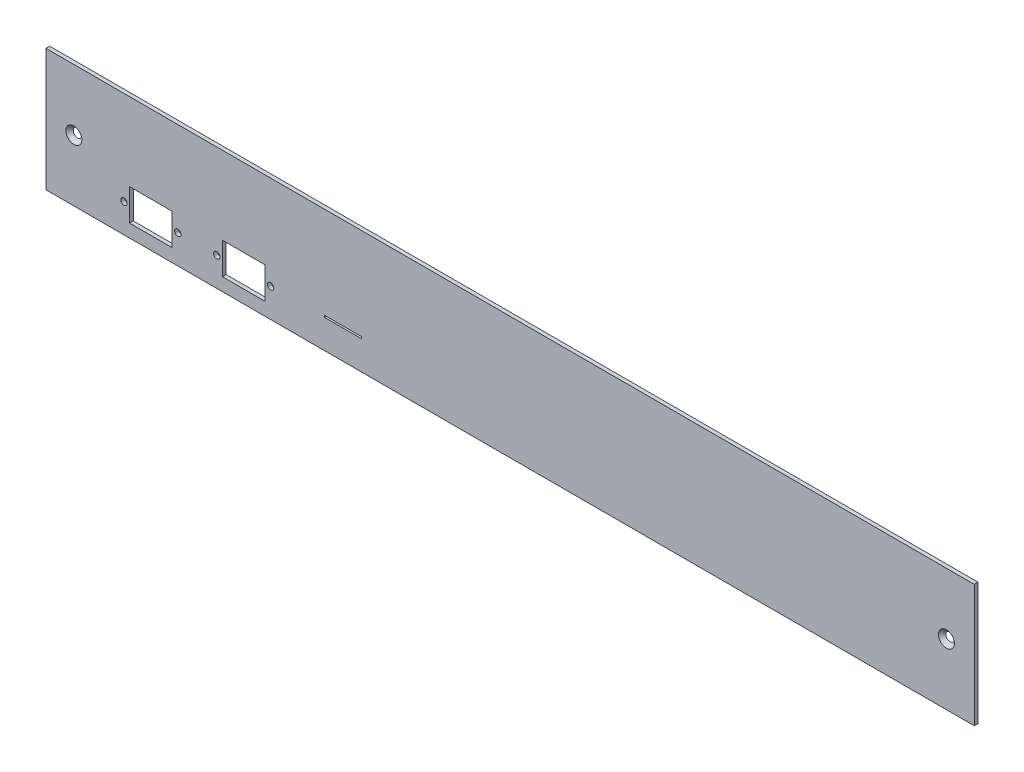
ISO-10303-21;
HEADER;
FILE_DESCRIPTION(('STEP AP214'),'2;1');
FILE_NAME('part.step','',(''),(''),'','','');
FILE_SCHEMA(('AUTOMOTIVE_DESIGN { 1 0 10303 214 1 1 1 1 }'));
ENDSEC;
DATA;
#1=APPLICATION_CONTEXT('core data for automotive mechanical design processes');
#2=APPLICATION_PROTOCOL_DEFINITION('international standard','automotive_design',2000,#1);
#3=PRODUCT_CONTEXT('',#1,'mechanical');
#4=PRODUCT('Part','Part','',(#3));
#5=PRODUCT_RELATED_PRODUCT_CATEGORY('part','',(#4));
#6=PRODUCT_DEFINITION_FORMATION('','',#4);
#7=PRODUCT_DEFINITION_CONTEXT('part definition',#1,'design');
#8=PRODUCT_DEFINITION('design','',#6,#7);
#9=PRODUCT_DEFINITION_SHAPE('','',#8);
#10=(LENGTH_UNIT() NAMED_UNIT(*) SI_UNIT(.MILLI.,.METRE.));
#11=(NAMED_UNIT(*) PLANE_ANGLE_UNIT() SI_UNIT($,.RADIAN.));
#12=(NAMED_UNIT(*) SI_UNIT($,.STERADIAN.) SOLID_ANGLE_UNIT());
#13=UNCERTAINTY_MEASURE_WITH_UNIT(LENGTH_MEASURE(1.E-05),#10,'distance_accuracy_value','');
#14=(GEOMETRIC_REPRESENTATION_CONTEXT(3) GLOBAL_UNCERTAINTY_ASSIGNED_CONTEXT((#13)) GLOBAL_UNIT_ASSIGNED_CONTEXT((#10,
#11,#12)) REPRESENTATION_CONTEXT('',''));
#15=CARTESIAN_POINT('',(0.,0.,0.));
#16=DIRECTION('',(0.,0.,1.));
#17=DIRECTION('',(1.,0.,0.));
#18=AXIS2_PLACEMENT_3D('',#15,#16,#17);
#19=CARTESIAN_POINT('',(-339.903846153846,-63.,2.));
#20=DIRECTION('',(-1.,0.,0.));
#21=DIRECTION('',(0.,-1.,0.));
#22=AXIS2_PLACEMENT_3D('',#19,#20,#21);
#23=PLANE('',#22);
#24=DIRECTION('',(0.,1.,0.));
#25=VECTOR('',#24,1.);
#26=CARTESIAN_POINT('',(-339.903846153846,-63.,0.));
#27=LINE('',#26,#25);
#28=CARTESIAN_POINT('',(-339.903846153846,-63.,0.));
#29=VERTEX_POINT('',#28);
#30=CARTESIAN_POINT('',(-339.903846153846,3.,0.));
#31=VERTEX_POINT('',#30);
#32=EDGE_CURVE('E280',#29,#31,#27,.T.);
#33=ORIENTED_EDGE('',*,*,#32,.F.);
#34=DIRECTION('',(0.,0.,-1.));
#35=VECTOR('',#34,1.);
#36=CARTESIAN_POINT('',(-339.903846153846,-63.,2.));
#37=LINE('',#36,#35);
#38=CARTESIAN_POINT('',(-339.903846153846,-63.,2.));
#39=VERTEX_POINT('',#38);
#40=EDGE_CURVE('E444',#39,#29,#37,.T.);
#41=ORIENTED_EDGE('',*,*,#40,.F.);
#42=DIRECTION('',(0.,1.,0.));
#43=VECTOR('',#42,1.);
#44=CARTESIAN_POINT('',(-339.903846153846,-63.,2.));
#45=LINE('',#44,#43);
#46=CARTESIAN_POINT('',(-339.903846153846,3.,2.));
#47=VERTEX_POINT('',#46);
#48=EDGE_CURVE('E263',#39,#47,#45,.T.);
#49=ORIENTED_EDGE('',*,*,#48,.T.);
#50=DIRECTION('',(0.,0.,-1.));
#51=VECTOR('',#50,1.);
#52=CARTESIAN_POINT('',(-339.903846153846,3.,2.));
#53=LINE('',#52,#51);
#54=EDGE_CURVE('E279',#47,#31,#53,.T.);
#55=ORIENTED_EDGE('',*,*,#54,.T.);
#56=EDGE_LOOP('',(#33,#41,#49,#55));
#57=FACE_BOUND('',#56,.T.);
#58=ADVANCED_FACE('F46',(#57),#23,.T.);
#59=CARTESIAN_POINT('',(-316.903846153846,-63.,2.));
#60=DIRECTION('',(0.,-1.,0.));
#61=DIRECTION('',(1.,0.,0.));
#62=AXIS2_PLACEMENT_3D('',#59,#60,#61);
#63=PLANE('',#62);
#64=DIRECTION('',(-1.,0.,0.));
#65=VECTOR('',#64,1.);
#66=CARTESIAN_POINT('',(-316.903846153846,-63.,0.));
#67=LINE('',#66,#65);
#68=CARTESIAN_POINT('',(160.096153846153,-62.9999999999999,0.));
#69=VERTEX_POINT('',#68);
#70=EDGE_CURVE('E268',#69,#29,#67,.T.);
#71=ORIENTED_EDGE('',*,*,#70,.F.);
#72=DIRECTION('',(0.,0.,-1.));
#73=VECTOR('',#72,1.);
#74=CARTESIAN_POINT('',(160.096153846153,-62.9999999999999,2.));
#75=LINE('',#74,#73);
#76=CARTESIAN_POINT('',(160.096153846153,-62.9999999999999,2.));
#77=VERTEX_POINT('',#76);
#78=EDGE_CURVE('E448',#77,#69,#75,.T.);
#79=ORIENTED_EDGE('',*,*,#78,.F.);
#80=DIRECTION('',(-1.,0.,0.));
#81=VECTOR('',#80,1.);
#82=CARTESIAN_POINT('',(160.096153846153,-62.9999999999999,2.));
#83=LINE('',#82,#81);
#84=EDGE_CURVE('E276',#77,#39,#83,.T.);
#85=ORIENTED_EDGE('',*,*,#84,.T.);
#86=ORIENTED_EDGE('',*,*,#40,.T.);
#87=EDGE_LOOP('',(#71,#79,#85,#86));
#88=FACE_BOUND('',#87,.T.);
#89=ADVANCED_FACE('F472',(#88),#63,.T.);
#90=CARTESIAN_POINT('',(160.096153846154,3.,2.));
#91=DIRECTION('',(1.,0.,0.));
#92=DIRECTION('',(0.,1.,0.));
#93=AXIS2_PLACEMENT_3D('',#90,#91,#92);
#94=PLANE('',#93);
#95=DIRECTION('',(0.,-1.,0.));
#96=VECTOR('',#95,1.);
#97=CARTESIAN_POINT('',(160.096153846154,3.,0.));
#98=LINE('',#97,#96);
#99=CARTESIAN_POINT('',(160.096153846154,3.,0.));
#100=VERTEX_POINT('',#99);
#101=EDGE_CURVE('E462',#100,#69,#98,.T.);
#102=ORIENTED_EDGE('',*,*,#101,.F.);
#103=DIRECTION('',(0.,0.,-1.));
#104=VECTOR('',#103,1.);
#105=CARTESIAN_POINT('',(160.096153846154,3.,2.));
#106=LINE('',#105,#104);
#107=CARTESIAN_POINT('',(160.096153846154,3.,2.));
#108=VERTEX_POINT('',#107);
#109=EDGE_CURVE('E453',#108,#100,#106,.T.);
#110=ORIENTED_EDGE('',*,*,#109,.F.);
#111=DIRECTION('',(0.,-1.,0.));
#112=VECTOR('',#111,1.);
#113=CARTESIAN_POINT('',(160.096153846154,3.,2.));
#114=LINE('',#113,#112);
#115=EDGE_CURVE('E272',#108,#77,#114,.T.);
#116=ORIENTED_EDGE('',*,*,#115,.T.);
#117=ORIENTED_EDGE('',*,*,#78,.T.);
#118=EDGE_LOOP('',(#102,#110,#116,#117));
#119=FACE_BOUND('',#118,.T.);
#120=ADVANCED_FACE('F468',(#119),#94,.T.);
#121=CARTESIAN_POINT('',(-339.903846153846,3.,2.));
#122=DIRECTION('',(0.,1.,0.));
#123=DIRECTION('',(0.,0.,1.));
#124=AXIS2_PLACEMENT_3D('',#121,#122,#123);
#125=PLANE('',#124);
#126=DIRECTION('',(1.,0.,0.));
#127=VECTOR('',#126,1.);
#128=CARTESIAN_POINT('',(-339.903846153846,3.,0.));
#129=LINE('',#128,#127);
#130=EDGE_CURVE('E285',#31,#100,#129,.T.);
#131=ORIENTED_EDGE('',*,*,#130,.F.);
#132=ORIENTED_EDGE('',*,*,#54,.F.);
#133=DIRECTION('',(1.,0.,0.));
#134=VECTOR('',#133,1.);
#135=CARTESIAN_POINT('',(-339.903846153846,3.,2.));
#136=LINE('',#135,#134);
#137=EDGE_CURVE('E267',#47,#108,#136,.T.);
#138=ORIENTED_EDGE('',*,*,#137,.T.);
#139=ORIENTED_EDGE('',*,*,#109,.T.);
#140=EDGE_LOOP('',(#131,#132,#138,#139));
#141=FACE_BOUND('',#140,.T.);
#142=ADVANCED_FACE('F418',(#141),#125,.T.);
#143=CARTESIAN_POINT('',(0.,0.,2.));
#144=DIRECTION('',(0.,0.,-1.));
#145=DIRECTION('',(-1.,0.,0.));
#146=AXIS2_PLACEMENT_3D('',#143,#144,#145);
#147=PLANE('',#146);
#148=CARTESIAN_POINT('',(-297.903846153846,-47.5,2.));
#149=DIRECTION('',(0.,0.,1.));
#150=DIRECTION('',(1.,0.,0.));
#151=AXIS2_PLACEMENT_3D('',#148,#149,#150);
#152=CIRCLE('',#151,1.69999999999996);
#153=CARTESIAN_POINT('',(-296.203846153846,-47.5,2.));
#154=VERTEX_POINT('',#153);
#155=EDGE_CURVE('E192',#154,#154,#152,.T.);
#156=ORIENTED_EDGE('',*,*,#155,.F.);
#157=EDGE_LOOP('',(#156));
#158=FACE_BOUND('',#157,.T.);
#159=CARTESIAN_POINT('',(-268.903846153846,-47.5,2.));
#160=DIRECTION('',(0.,0.,1.));
#161=DIRECTION('',(1.,0.,0.));
#162=AXIS2_PLACEMENT_3D('',#159,#160,#161);
#163=CIRCLE('',#162,1.6999999999999);
#164=CARTESIAN_POINT('',(-267.203846153846,-47.5,2.));
#165=VERTEX_POINT('',#164);
#166=EDGE_CURVE('E187',#165,#165,#163,.T.);
#167=ORIENTED_EDGE('',*,*,#166,.F.);
#168=EDGE_LOOP('',(#167));
#169=FACE_BOUND('',#168,.T.);
#170=DIRECTION('',(1.,0.,0.));
#171=VECTOR('',#170,1.);
#172=CARTESIAN_POINT('',(-189.903846153846,-47.5,2.));
#173=LINE('',#172,#171);
#174=CARTESIAN_POINT('',(-189.903846153846,-47.5,2.));
#175=VERTEX_POINT('',#174);
#176=CARTESIAN_POINT('',(-169.903846153846,-47.5,2.));
#177=VERTEX_POINT('',#176);
#178=EDGE_CURVE('E185',#175,#177,#173,.T.);
#179=ORIENTED_EDGE('',*,*,#178,.F.);
#180=DIRECTION('',(0.,-1.,0.));
#181=VECTOR('',#180,1.);
#182=CARTESIAN_POINT('',(-189.903846153846,-46.5,2.));
#183=LINE('',#182,#181);
#184=CARTESIAN_POINT('',(-189.903846153846,-46.5,2.));
#185=VERTEX_POINT('',#184);
#186=EDGE_CURVE('E64',#185,#175,#183,.T.);
#187=ORIENTED_EDGE('',*,*,#186,.F.);
#188=DIRECTION('',(-1.,0.,0.));
#189=VECTOR('',#188,1.);
#190=CARTESIAN_POINT('',(-189.903846153846,-46.5,2.));
#191=LINE('',#190,#189);
#192=CARTESIAN_POINT('',(-169.903846153846,-46.5,2.));
#193=VERTEX_POINT('',#192);
#194=EDGE_CURVE('E171',#193,#185,#191,.T.);
#195=ORIENTED_EDGE('',*,*,#194,.F.);
#196=DIRECTION('',(0.,1.,0.));
#197=VECTOR('',#196,1.);
#198=CARTESIAN_POINT('',(-169.903846153846,-46.5,2.));
#199=LINE('',#198,#197);
#200=EDGE_CURVE('E178',#177,#193,#199,.T.);
#201=ORIENTED_EDGE('',*,*,#200,.F.);
#202=EDGE_LOOP('',(#179,#187,#195,#201));
#203=FACE_BOUND('',#202,.T.);
#204=DIRECTION('',(1.,0.,0.));
#205=VECTOR('',#204,1.);
#206=CARTESIAN_POINT('',(-244.903846153846,-56.,2.));
#207=LINE('',#206,#205);
#208=CARTESIAN_POINT('',(-244.903846153846,-56.,2.));
#209=VERTEX_POINT('',#208);
#210=CARTESIAN_POINT('',(-221.903846153846,-56.,2.));
#211=VERTEX_POINT('',#210);
#212=EDGE_CURVE('E218',#209,#211,#207,.T.);
#213=ORIENTED_EDGE('',*,*,#212,.F.);
#214=DIRECTION('',(0.,-1.,0.));
#215=VECTOR('',#214,1.);
#216=CARTESIAN_POINT('',(-244.903846153846,-39.,2.));
#217=LINE('',#216,#215);
#218=CARTESIAN_POINT('',(-244.903846153846,-39.,2.));
#219=VERTEX_POINT('',#218);
#220=EDGE_CURVE('E72',#219,#209,#217,.T.);
#221=ORIENTED_EDGE('',*,*,#220,.F.);
#222=DIRECTION('',(-1.,0.,0.));
#223=VECTOR('',#222,1.);
#224=CARTESIAN_POINT('',(-244.903846153846,-39.,2.));
#225=LINE('',#224,#223);
#226=CARTESIAN_POINT('',(-221.903846153846,-39.,2.));
#227=VERTEX_POINT('',#226);
#228=EDGE_CURVE('E200',#227,#219,#225,.T.);
#229=ORIENTED_EDGE('',*,*,#228,.F.);
#230=DIRECTION('',(0.,1.,0.));
#231=VECTOR('',#230,1.);
#232=CARTESIAN_POINT('',(-221.903846153846,-39.,2.));
#233=LINE('',#232,#231);
#234=EDGE_CURVE('E214',#211,#227,#233,.T.);
#235=ORIENTED_EDGE('',*,*,#234,.F.);
#236=EDGE_LOOP('',(#213,#221,#229,#235));
#237=FACE_BOUND('',#236,.T.);
#238=CARTESIAN_POINT('',(-247.903846153846,-47.5,2.));
#239=DIRECTION('',(0.,0.,1.));
#240=DIRECTION('',(1.,0.,0.));
#241=AXIS2_PLACEMENT_3D('',#238,#239,#240);
#242=CIRCLE('',#241,1.69999999999996);
#243=CARTESIAN_POINT('',(-246.203846153846,-47.5,2.));
#244=VERTEX_POINT('',#243);
#245=EDGE_CURVE('E210',#244,#244,#242,.T.);
#246=ORIENTED_EDGE('',*,*,#245,.F.);
#247=EDGE_LOOP('',(#246));
#248=FACE_BOUND('',#247,.T.);
#249=CARTESIAN_POINT('',(-218.903846153846,-47.5,2.));
#250=DIRECTION('',(0.,0.,1.));
#251=DIRECTION('',(1.,0.,0.));
#252=AXIS2_PLACEMENT_3D('',#249,#250,#251);
#253=CIRCLE('',#252,1.6999999999999);
#254=CARTESIAN_POINT('',(-217.203846153846,-47.5,2.));
#255=VERTEX_POINT('',#254);
#256=EDGE_CURVE('E427',#255,#255,#253,.T.);
#257=ORIENTED_EDGE('',*,*,#256,.F.);
#258=EDGE_LOOP('',(#257));
#259=FACE_BOUND('',#258,.T.);
#260=DIRECTION('',(1.,0.,0.));
#261=VECTOR('',#260,1.);
#262=CARTESIAN_POINT('',(-294.903846153846,-56.,2.));
#263=LINE('',#262,#261);
#264=CARTESIAN_POINT('',(-294.903846153846,-56.,2.));
#265=VERTEX_POINT('',#264);
#266=CARTESIAN_POINT('',(-271.903846153846,-56.,2.));
#267=VERTEX_POINT('',#266);
#268=EDGE_CURVE('E227',#265,#267,#263,.T.);
#269=ORIENTED_EDGE('',*,*,#268,.F.);
#270=DIRECTION('',(0.,-1.,0.));
#271=VECTOR('',#270,1.);
#272=CARTESIAN_POINT('',(-294.903846153846,-39.,2.));
#273=LINE('',#272,#271);
#274=CARTESIAN_POINT('',(-294.903846153846,-39.,2.));
#275=VERTEX_POINT('',#274);
#276=EDGE_CURVE('E224',#275,#265,#273,.T.);
#277=ORIENTED_EDGE('',*,*,#276,.F.);
#278=DIRECTION('',(-1.,0.,0.));
#279=VECTOR('',#278,1.);
#280=CARTESIAN_POINT('',(-294.903846153846,-39.,2.));
#281=LINE('',#280,#279);
#282=CARTESIAN_POINT('',(-271.903846153846,-39.,2.));
#283=VERTEX_POINT('',#282);
#284=EDGE_CURVE('E235',#283,#275,#281,.T.);
#285=ORIENTED_EDGE('',*,*,#284,.F.);
#286=DIRECTION('',(0.,1.,0.));
#287=VECTOR('',#286,1.);
#288=CARTESIAN_POINT('',(-271.903846153846,-39.,2.));
#289=LINE('',#288,#287);
#290=EDGE_CURVE('E231',#267,#283,#289,.T.);
#291=ORIENTED_EDGE('',*,*,#290,.F.);
#292=EDGE_LOOP('',(#269,#277,#285,#291));
#293=FACE_BOUND('',#292,.T.);
#294=CARTESIAN_POINT('',(-324.903846153846,-30.,2.));
#295=DIRECTION('',(0.,0.,1.));
#296=DIRECTION('',(1.,0.,0.));
#297=AXIS2_PLACEMENT_3D('',#294,#295,#296);
#298=CIRCLE('',#297,4.30000000000003);
#299=CARTESIAN_POINT('',(-320.603846153846,-30.,2.));
#300=VERTEX_POINT('',#299);
#301=EDGE_CURVE('E253',#300,#300,#298,.T.);
#302=ORIENTED_EDGE('',*,*,#301,.F.);
#303=EDGE_LOOP('',(#302));
#304=FACE_BOUND('',#303,.T.);
#305=CARTESIAN_POINT('',(145.096153846153,-30.,2.));
#306=DIRECTION('',(0.,0.,1.));
#307=DIRECTION('',(1.,0.,0.));
#308=AXIS2_PLACEMENT_3D('',#305,#306,#307);
#309=CIRCLE('',#308,4.3);
#310=CARTESIAN_POINT('',(149.396153846153,-30.,2.));
#311=VERTEX_POINT('',#310);
#312=EDGE_CURVE('E258',#311,#311,#309,.T.);
#313=ORIENTED_EDGE('',*,*,#312,.F.);
#314=EDGE_LOOP('',(#313));
#315=FACE_BOUND('',#314,.T.);
#316=ORIENTED_EDGE('',*,*,#48,.F.);
#317=ORIENTED_EDGE('',*,*,#84,.F.);
#318=ORIENTED_EDGE('',*,*,#115,.F.);
#319=ORIENTED_EDGE('',*,*,#137,.F.);
#320=EDGE_LOOP('',(#316,#317,#318,#319));
#321=FACE_BOUND('',#320,.T.);
#322=ADVANCED_FACE('F182',(#158,#169,#203,#237,#248,#259,#293,#304,#315,#321),#147,.F.);
#323=CARTESIAN_POINT('',(0.,0.,0.));
#324=DIRECTION('',(0.,0.,-1.));
#325=DIRECTION('',(-1.,0.,0.));
#326=AXIS2_PLACEMENT_3D('',#323,#324,#325);
#327=PLANE('',#326);
#328=ORIENTED_EDGE('',*,*,#101,.T.);
#329=ORIENTED_EDGE('',*,*,#70,.T.);
#330=ORIENTED_EDGE('',*,*,#32,.T.);
#331=ORIENTED_EDGE('',*,*,#130,.T.);
#332=EDGE_LOOP('',(#328,#329,#330,#331));
#333=FACE_BOUND('',#332,.T.);
#334=CARTESIAN_POINT('',(-297.903846153846,-47.5,0.));
#335=DIRECTION('',(0.,0.,-1.));
#336=DIRECTION('',(-1.,0.,0.));
#337=AXIS2_PLACEMENT_3D('',#334,#335,#336);
#338=CIRCLE('',#337,1.69999999999996);
#339=CARTESIAN_POINT('',(-299.603846153846,-47.5,0.));
#340=VERTEX_POINT('',#339);
#341=EDGE_CURVE('E49',#340,#340,#338,.T.);
#342=ORIENTED_EDGE('',*,*,#341,.F.);
#343=EDGE_LOOP('',(#342));
#344=FACE_BOUND('',#343,.T.);
#345=CARTESIAN_POINT('',(-268.903846153846,-47.5,0.));
#346=DIRECTION('',(0.,0.,-1.));
#347=DIRECTION('',(-1.,0.,0.));
#348=AXIS2_PLACEMENT_3D('',#345,#346,#347);
#349=CIRCLE('',#348,1.6999999999999);
#350=CARTESIAN_POINT('',(-270.603846153846,-47.5,0.));
#351=VERTEX_POINT('',#350);
#352=EDGE_CURVE('E297',#351,#351,#349,.T.);
#353=ORIENTED_EDGE('',*,*,#352,.F.);
#354=EDGE_LOOP('',(#353));
#355=FACE_BOUND('',#354,.T.);
#356=DIRECTION('',(0.,1.,0.));
#357=VECTOR('',#356,1.);
#358=CARTESIAN_POINT('',(-189.903846153846,0.,0.));
#359=LINE('',#358,#357);
#360=CARTESIAN_POINT('',(-189.903846153846,-47.5,0.));
#361=VERTEX_POINT('',#360);
#362=CARTESIAN_POINT('',(-189.903846153846,-46.5,0.));
#363=VERTEX_POINT('',#362);
#364=EDGE_CURVE('E12',#361,#363,#359,.T.);
#365=ORIENTED_EDGE('',*,*,#364,.F.);
#366=DIRECTION('',(-1.,0.,0.));
#367=VECTOR('',#366,1.);
#368=CARTESIAN_POINT('',(0.,-47.5,0.));
#369=LINE('',#368,#367);
#370=CARTESIAN_POINT('',(-169.903846153846,-47.5,0.));
#371=VERTEX_POINT('',#370);
#372=EDGE_CURVE('E321',#371,#361,#369,.T.);
#373=ORIENTED_EDGE('',*,*,#372,.F.);
#374=DIRECTION('',(0.,-1.,0.));
#375=VECTOR('',#374,1.);
#376=CARTESIAN_POINT('',(-169.903846153846,0.,0.));
#377=LINE('',#376,#375);
#378=CARTESIAN_POINT('',(-169.903846153846,-46.5,0.));
#379=VERTEX_POINT('',#378);
#380=EDGE_CURVE('E307',#379,#371,#377,.T.);
#381=ORIENTED_EDGE('',*,*,#380,.F.);
#382=DIRECTION('',(1.,0.,0.));
#383=VECTOR('',#382,1.);
#384=CARTESIAN_POINT('',(0.,-46.5,0.));
#385=LINE('',#384,#383);
#386=EDGE_CURVE('E56',#363,#379,#385,.T.);
#387=ORIENTED_EDGE('',*,*,#386,.F.);
#388=EDGE_LOOP('',(#365,#373,#381,#387));
#389=FACE_BOUND('',#388,.T.);
#390=DIRECTION('',(0.,1.,0.));
#391=VECTOR('',#390,1.);
#392=CARTESIAN_POINT('',(-244.903846153846,0.,0.));
#393=LINE('',#392,#391);
#394=CARTESIAN_POINT('',(-244.903846153846,-56.,0.));
#395=VERTEX_POINT('',#394);
#396=CARTESIAN_POINT('',(-244.903846153846,-39.,0.));
#397=VERTEX_POINT('',#396);
#398=EDGE_CURVE('E317',#395,#397,#393,.T.);
#399=ORIENTED_EDGE('',*,*,#398,.F.);
#400=DIRECTION('',(-1.,0.,0.));
#401=VECTOR('',#400,1.);
#402=CARTESIAN_POINT('',(0.,-56.,0.));
#403=LINE('',#402,#401);
#404=CARTESIAN_POINT('',(-221.903846153846,-56.,0.));
#405=VERTEX_POINT('',#404);
#406=EDGE_CURVE('E387',#405,#395,#403,.T.);
#407=ORIENTED_EDGE('',*,*,#406,.F.);
#408=DIRECTION('',(0.,-1.,0.));
#409=VECTOR('',#408,1.);
#410=CARTESIAN_POINT('',(-221.903846153846,0.,0.));
#411=LINE('',#410,#409);
#412=CARTESIAN_POINT('',(-221.903846153846,-39.,0.));
#413=VERTEX_POINT('',#412);
#414=EDGE_CURVE('E398',#413,#405,#411,.T.);
#415=ORIENTED_EDGE('',*,*,#414,.F.);
#416=DIRECTION('',(1.,0.,0.));
#417=VECTOR('',#416,1.);
#418=CARTESIAN_POINT('',(0.,-39.,0.));
#419=LINE('',#418,#417);
#420=EDGE_CURVE('E322',#397,#413,#419,.T.);
#421=ORIENTED_EDGE('',*,*,#420,.F.);
#422=EDGE_LOOP('',(#399,#407,#415,#421));
#423=FACE_BOUND('',#422,.T.);
#424=CARTESIAN_POINT('',(-247.903846153846,-47.5,0.));
#425=DIRECTION('',(0.,0.,-1.));
#426=DIRECTION('',(-1.,0.,0.));
#427=AXIS2_PLACEMENT_3D('',#424,#425,#426);
#428=CIRCLE('',#427,1.69999999999996);
#429=CARTESIAN_POINT('',(-249.603846153846,-47.5,0.));
#430=VERTEX_POINT('',#429);
#431=EDGE_CURVE('E301',#430,#430,#428,.T.);
#432=ORIENTED_EDGE('',*,*,#431,.F.);
#433=EDGE_LOOP('',(#432));
#434=FACE_BOUND('',#433,.T.);
#435=CARTESIAN_POINT('',(-218.903846153846,-47.5,0.));
#436=DIRECTION('',(0.,0.,-1.));
#437=DIRECTION('',(-1.,0.,0.));
#438=AXIS2_PLACEMENT_3D('',#435,#436,#437);
#439=CIRCLE('',#438,1.6999999999999);
#440=CARTESIAN_POINT('',(-220.603846153846,-47.5,0.));
#441=VERTEX_POINT('',#440);
#442=EDGE_CURVE('E243',#441,#441,#439,.T.);
#443=ORIENTED_EDGE('',*,*,#442,.F.);
#444=EDGE_LOOP('',(#443));
#445=FACE_BOUND('',#444,.T.);
#446=DIRECTION('',(0.,1.,0.));
#447=VECTOR('',#446,1.);
#448=CARTESIAN_POINT('',(-294.903846153846,0.,0.));
#449=LINE('',#448,#447);
#450=CARTESIAN_POINT('',(-294.903846153846,-56.,0.));
#451=VERTEX_POINT('',#450);
#452=CARTESIAN_POINT('',(-294.903846153846,-39.,0.));
#453=VERTEX_POINT('',#452);
#454=EDGE_CURVE('E356',#451,#453,#449,.T.);
#455=ORIENTED_EDGE('',*,*,#454,.F.);
#456=DIRECTION('',(-1.,0.,0.));
#457=VECTOR('',#456,1.);
#458=CARTESIAN_POINT('',(0.,-56.,0.));
#459=LINE('',#458,#457);
#460=CARTESIAN_POINT('',(-271.903846153846,-56.,0.));
#461=VERTEX_POINT('',#460);
#462=EDGE_CURVE('E371',#461,#451,#459,.T.);
#463=ORIENTED_EDGE('',*,*,#462,.F.);
#464=DIRECTION('',(0.,-1.,0.));
#465=VECTOR('',#464,1.);
#466=CARTESIAN_POINT('',(-271.903846153846,0.,0.));
#467=LINE('',#466,#465);
#468=CARTESIAN_POINT('',(-271.903846153846,-39.,0.));
#469=VERTEX_POINT('',#468);
#470=EDGE_CURVE('E382',#469,#461,#467,.T.);
#471=ORIENTED_EDGE('',*,*,#470,.F.);
#472=DIRECTION('',(1.,0.,0.));
#473=VECTOR('',#472,1.);
#474=CARTESIAN_POINT('',(0.,-39.,0.));
#475=LINE('',#474,#473);
#476=EDGE_CURVE('E378',#453,#469,#475,.T.);
#477=ORIENTED_EDGE('',*,*,#476,.F.);
#478=EDGE_LOOP('',(#455,#463,#471,#477));
#479=FACE_BOUND('',#478,.T.);
#480=CARTESIAN_POINT('',(-324.903846153846,-30.,0.));
#481=DIRECTION('',(0.,0.,-1.));
#482=DIRECTION('',(-1.,0.,0.));
#483=AXIS2_PLACEMENT_3D('',#480,#481,#482);
#484=CIRCLE('',#483,2.29999999999997);
#485=CARTESIAN_POINT('',(-327.203846153846,-30.,0.));
#486=VERTEX_POINT('',#485);
#487=EDGE_CURVE('E257',#486,#486,#484,.T.);
#488=ORIENTED_EDGE('',*,*,#487,.F.);
#489=EDGE_LOOP('',(#488));
#490=FACE_BOUND('',#489,.T.);
#491=CARTESIAN_POINT('',(145.096153846153,-30.,0.));
#492=DIRECTION('',(0.,0.,-1.));
#493=DIRECTION('',(-1.,0.,0.));
#494=AXIS2_PLACEMENT_3D('',#491,#492,#493);
#495=CIRCLE('',#494,2.3);
#496=CARTESIAN_POINT('',(142.796153846153,-30.,0.));
#497=VERTEX_POINT('',#496);
#498=EDGE_CURVE('E262',#497,#497,#495,.T.);
#499=ORIENTED_EDGE('',*,*,#498,.F.);
#500=EDGE_LOOP('',(#499));
#501=FACE_BOUND('',#500,.T.);
#502=ADVANCED_FACE('F336',(#333,#344,#355,#389,#423,#434,#445,#479,#490,#501),#327,.T.);
#503=CARTESIAN_POINT('',(145.096153846153,-30.,2.));
#504=DIRECTION('',(0.,0.,1.));
#505=DIRECTION('',(1.,0.,0.));
#506=AXIS2_PLACEMENT_3D('',#503,#504,#505);
#507=CONICAL_SURFACE('',#506,4.3,0.785398163397448);
#508=ORIENTED_EDGE('',*,*,#498,.T.);
#509=EDGE_LOOP('',(#508));
#510=FACE_BOUND('',#509,.T.);
#511=ORIENTED_EDGE('',*,*,#312,.T.);
#512=EDGE_LOOP('',(#511));
#513=FACE_BOUND('',#512,.T.);
#514=ADVANCED_FACE('F339',(#510,#513),#507,.F.);
#515=CARTESIAN_POINT('',(-324.903846153846,-30.,2.));
#516=DIRECTION('',(0.,0.,1.));
#517=DIRECTION('',(1.,0.,0.));
#518=AXIS2_PLACEMENT_3D('',#515,#516,#517);
#519=CONICAL_SURFACE('',#518,4.30000000000003,0.785398163397461);
#520=ORIENTED_EDGE('',*,*,#487,.T.);
#521=EDGE_LOOP('',(#520));
#522=FACE_BOUND('',#521,.T.);
#523=ORIENTED_EDGE('',*,*,#301,.T.);
#524=EDGE_LOOP('',(#523));
#525=FACE_BOUND('',#524,.T.);
#526=ADVANCED_FACE('F485',(#522,#525),#519,.F.);
#527=CARTESIAN_POINT('',(-294.903846153846,-39.,-8.));
#528=DIRECTION('',(-1.,0.,0.));
#529=DIRECTION('',(0.,0.,1.));
#530=AXIS2_PLACEMENT_3D('',#527,#528,#529);
#531=PLANE('',#530);
#532=ORIENTED_EDGE('',*,*,#454,.T.);
#533=DIRECTION('',(0.,0.,1.));
#534=VECTOR('',#533,1.);
#535=CARTESIAN_POINT('',(-294.903846153846,-39.,-8.));
#536=LINE('',#535,#534);
#537=EDGE_CURVE('E240',#453,#275,#536,.T.);
#538=ORIENTED_EDGE('',*,*,#537,.T.);
#539=ORIENTED_EDGE('',*,*,#276,.T.);
#540=DIRECTION('',(0.,0.,1.));
#541=VECTOR('',#540,1.);
#542=CARTESIAN_POINT('',(-294.903846153846,-56.,-8.));
#543=LINE('',#542,#541);
#544=EDGE_CURVE('E239',#451,#265,#543,.T.);
#545=ORIENTED_EDGE('',*,*,#544,.F.);
#546=EDGE_LOOP('',(#532,#538,#539,#545));
#547=FACE_BOUND('',#546,.T.);
#548=ADVANCED_FACE('F488',(#547),#531,.F.);
#549=CARTESIAN_POINT('',(-294.903846153846,-39.,-8.));
#550=DIRECTION('',(0.,1.,0.));
#551=DIRECTION('',(0.,0.,1.));
#552=AXIS2_PLACEMENT_3D('',#549,#550,#551);
#553=PLANE('',#552);
#554=ORIENTED_EDGE('',*,*,#476,.T.);
#555=DIRECTION('',(0.,0.,1.));
#556=VECTOR('',#555,1.);
#557=CARTESIAN_POINT('',(-271.903846153846,-39.,-8.));
#558=LINE('',#557,#556);
#559=EDGE_CURVE('E244',#469,#283,#558,.T.);
#560=ORIENTED_EDGE('',*,*,#559,.T.);
#561=ORIENTED_EDGE('',*,*,#284,.T.);
#562=ORIENTED_EDGE('',*,*,#537,.F.);
#563=EDGE_LOOP('',(#554,#560,#561,#562));
#564=FACE_BOUND('',#563,.T.);
#565=ADVANCED_FACE('F492',(#564),#553,.F.);
#566=CARTESIAN_POINT('',(-271.903846153846,-39.,-8.));
#567=DIRECTION('',(1.,0.,0.));
#568=DIRECTION('',(0.,0.,-1.));
#569=AXIS2_PLACEMENT_3D('',#566,#567,#568);
#570=PLANE('',#569);
#571=ORIENTED_EDGE('',*,*,#470,.T.);
#572=DIRECTION('',(0.,0.,1.));
#573=VECTOR('',#572,1.);
#574=CARTESIAN_POINT('',(-271.903846153846,-56.,-8.));
#575=LINE('',#574,#573);
#576=EDGE_CURVE('E247',#461,#267,#575,.T.);
#577=ORIENTED_EDGE('',*,*,#576,.T.);
#578=ORIENTED_EDGE('',*,*,#290,.T.);
#579=ORIENTED_EDGE('',*,*,#559,.F.);
#580=EDGE_LOOP('',(#571,#577,#578,#579));
#581=FACE_BOUND('',#580,.T.);
#582=ADVANCED_FACE('F498',(#581),#570,.F.);
#583=CARTESIAN_POINT('',(-294.903846153846,-56.,-8.));
#584=DIRECTION('',(0.,-1.,0.));
#585=DIRECTION('',(0.,0.,-1.));
#586=AXIS2_PLACEMENT_3D('',#583,#584,#585);
#587=PLANE('',#586);
#588=ORIENTED_EDGE('',*,*,#462,.T.);
#589=ORIENTED_EDGE('',*,*,#544,.T.);
#590=ORIENTED_EDGE('',*,*,#268,.T.);
#591=ORIENTED_EDGE('',*,*,#576,.F.);
#592=EDGE_LOOP('',(#588,#589,#590,#591));
#593=FACE_BOUND('',#592,.T.);
#594=ADVANCED_FACE('F494',(#593),#587,.F.);
#595=CARTESIAN_POINT('',(-218.903846153846,-47.5,-8.));
#596=DIRECTION('',(0.,0.,1.));
#597=DIRECTION('',(1.,0.,0.));
#598=AXIS2_PLACEMENT_3D('',#595,#596,#597);
#599=CYLINDRICAL_SURFACE('',#598,1.6999999999999);
#600=ORIENTED_EDGE('',*,*,#442,.T.);
#601=EDGE_LOOP('',(#600));
#602=FACE_BOUND('',#601,.T.);
#603=ORIENTED_EDGE('',*,*,#256,.T.);
#604=EDGE_LOOP('',(#603));
#605=FACE_BOUND('',#604,.T.);
#606=ADVANCED_FACE('F497',(#602,#605),#599,.F.);
#607=CARTESIAN_POINT('',(-247.903846153846,-47.5,-8.));
#608=DIRECTION('',(0.,0.,1.));
#609=DIRECTION('',(1.,0.,0.));
#610=AXIS2_PLACEMENT_3D('',#607,#608,#609);
#611=CYLINDRICAL_SURFACE('',#610,1.69999999999996);
#612=ORIENTED_EDGE('',*,*,#431,.T.);
#613=EDGE_LOOP('',(#612));
#614=FACE_BOUND('',#613,.T.);
#615=ORIENTED_EDGE('',*,*,#245,.T.);
#616=EDGE_LOOP('',(#615));
#617=FACE_BOUND('',#616,.T.);
#618=ADVANCED_FACE('F514',(#614,#617),#611,.F.);
#619=CARTESIAN_POINT('',(-244.903846153846,-39.,-8.));
#620=DIRECTION('',(-1.,0.,0.));
#621=DIRECTION('',(0.,0.,1.));
#622=AXIS2_PLACEMENT_3D('',#619,#620,#621);
#623=PLANE('',#622);
#624=ORIENTED_EDGE('',*,*,#398,.T.);
#625=DIRECTION('',(0.,0.,1.));
#626=VECTOR('',#625,1.);
#627=CARTESIAN_POINT('',(-244.903846153846,-39.,-8.));
#628=LINE('',#627,#626);
#629=EDGE_CURVE('E207',#397,#219,#628,.T.);
#630=ORIENTED_EDGE('',*,*,#629,.T.);
#631=ORIENTED_EDGE('',*,*,#220,.T.);
#632=DIRECTION('',(0.,0.,1.));
#633=VECTOR('',#632,1.);
#634=CARTESIAN_POINT('',(-244.903846153846,-56.,-8.));
#635=LINE('',#634,#633);
#636=EDGE_CURVE('E197',#395,#209,#635,.T.);
#637=ORIENTED_EDGE('',*,*,#636,.F.);
#638=EDGE_LOOP('',(#624,#630,#631,#637));
#639=FACE_BOUND('',#638,.T.);
#640=ADVANCED_FACE('F415',(#639),#623,.F.);
#641=CARTESIAN_POINT('',(-244.903846153846,-39.,-8.));
#642=DIRECTION('',(0.,1.,0.));
#643=DIRECTION('',(0.,0.,1.));
#644=AXIS2_PLACEMENT_3D('',#641,#642,#643);
#645=PLANE('',#644);
#646=ORIENTED_EDGE('',*,*,#420,.T.);
#647=DIRECTION('',(0.,0.,1.));
#648=VECTOR('',#647,1.);
#649=CARTESIAN_POINT('',(-221.903846153846,-39.,-8.));
#650=LINE('',#649,#648);
#651=EDGE_CURVE('E204',#413,#227,#650,.T.);
#652=ORIENTED_EDGE('',*,*,#651,.T.);
#653=ORIENTED_EDGE('',*,*,#228,.T.);
#654=ORIENTED_EDGE('',*,*,#629,.F.);
#655=EDGE_LOOP('',(#646,#652,#653,#654));
#656=FACE_BOUND('',#655,.T.);
#657=ADVANCED_FACE('F408',(#656),#645,.F.);
#658=CARTESIAN_POINT('',(-221.903846153846,-39.,-8.));
#659=DIRECTION('',(1.,0.,0.));
#660=DIRECTION('',(0.,0.,-1.));
#661=AXIS2_PLACEMENT_3D('',#658,#659,#660);
#662=PLANE('',#661);
#663=ORIENTED_EDGE('',*,*,#414,.T.);
#664=DIRECTION('',(0.,0.,1.));
#665=VECTOR('',#664,1.);
#666=CARTESIAN_POINT('',(-221.903846153846,-56.,-8.));
#667=LINE('',#666,#665);
#668=EDGE_CURVE('E201',#405,#211,#667,.T.);
#669=ORIENTED_EDGE('',*,*,#668,.T.);
#670=ORIENTED_EDGE('',*,*,#234,.T.);
#671=ORIENTED_EDGE('',*,*,#651,.F.);
#672=EDGE_LOOP('',(#663,#669,#670,#671));
#673=FACE_BOUND('',#672,.T.);
#674=ADVANCED_FACE('F409',(#673),#662,.F.);
#675=CARTESIAN_POINT('',(-244.903846153846,-56.,-8.));
#676=DIRECTION('',(0.,-1.,0.));
#677=DIRECTION('',(0.,0.,-1.));
#678=AXIS2_PLACEMENT_3D('',#675,#676,#677);
#679=PLANE('',#678);
#680=ORIENTED_EDGE('',*,*,#406,.T.);
#681=ORIENTED_EDGE('',*,*,#636,.T.);
#682=ORIENTED_EDGE('',*,*,#212,.T.);
#683=ORIENTED_EDGE('',*,*,#668,.F.);
#684=EDGE_LOOP('',(#680,#681,#682,#683));
#685=FACE_BOUND('',#684,.T.);
#686=ADVANCED_FACE('F413',(#685),#679,.F.);
#687=CARTESIAN_POINT('',(-189.903846153846,-46.5,-8.));
#688=DIRECTION('',(-1.,0.,0.));
#689=DIRECTION('',(0.,0.,1.));
#690=AXIS2_PLACEMENT_3D('',#687,#688,#689);
#691=PLANE('',#690);
#692=ORIENTED_EDGE('',*,*,#364,.T.);
#693=DIRECTION('',(0.,0.,1.));
#694=VECTOR('',#693,1.);
#695=CARTESIAN_POINT('',(-189.903846153846,-46.5,-8.));
#696=LINE('',#695,#694);
#697=EDGE_CURVE('E161',#363,#185,#696,.T.);
#698=ORIENTED_EDGE('',*,*,#697,.T.);
#699=ORIENTED_EDGE('',*,*,#186,.T.);
#700=DIRECTION('',(0.,0.,1.));
#701=VECTOR('',#700,1.);
#702=CARTESIAN_POINT('',(-189.903846153846,-47.5,-8.));
#703=LINE('',#702,#701);
#704=EDGE_CURVE('E179',#361,#175,#703,.T.);
#705=ORIENTED_EDGE('',*,*,#704,.F.);
#706=EDGE_LOOP('',(#692,#698,#699,#705));
#707=FACE_BOUND('',#706,.T.);
#708=ADVANCED_FACE('F163',(#707),#691,.F.);
#709=CARTESIAN_POINT('',(-189.903846153846,-46.5,-8.));
#710=DIRECTION('',(0.,1.,0.));
#711=DIRECTION('',(0.,0.,1.));
#712=AXIS2_PLACEMENT_3D('',#709,#710,#711);
#713=PLANE('',#712);
#714=ORIENTED_EDGE('',*,*,#386,.T.);
#715=DIRECTION('',(0.,0.,1.));
#716=VECTOR('',#715,1.);
#717=CARTESIAN_POINT('',(-169.903846153846,-46.5,-8.));
#718=LINE('',#717,#716);
#719=EDGE_CURVE('E168',#379,#193,#718,.T.);
#720=ORIENTED_EDGE('',*,*,#719,.T.);
#721=ORIENTED_EDGE('',*,*,#194,.T.);
#722=ORIENTED_EDGE('',*,*,#697,.F.);
#723=EDGE_LOOP('',(#714,#720,#721,#722));
#724=FACE_BOUND('',#723,.T.);
#725=ADVANCED_FACE('F172',(#724),#713,.F.);
#726=CARTESIAN_POINT('',(-169.903846153846,-46.5,-8.));
#727=DIRECTION('',(1.,0.,0.));
#728=DIRECTION('',(0.,0.,-1.));
#729=AXIS2_PLACEMENT_3D('',#726,#727,#728);
#730=PLANE('',#729);
#731=ORIENTED_EDGE('',*,*,#380,.T.);
#732=DIRECTION('',(0.,0.,1.));
#733=VECTOR('',#732,1.);
#734=CARTESIAN_POINT('',(-169.903846153846,-47.5,-8.));
#735=LINE('',#734,#733);
#736=EDGE_CURVE('E334',#371,#177,#735,.T.);
#737=ORIENTED_EDGE('',*,*,#736,.T.);
#738=ORIENTED_EDGE('',*,*,#200,.T.);
#739=ORIENTED_EDGE('',*,*,#719,.F.);
#740=EDGE_LOOP('',(#731,#737,#738,#739));
#741=FACE_BOUND('',#740,.T.);
#742=ADVANCED_FACE('F333',(#741),#730,.F.);
#743=CARTESIAN_POINT('',(-189.903846153846,-47.5,-8.));
#744=DIRECTION('',(0.,-1.,0.));
#745=DIRECTION('',(0.,0.,-1.));
#746=AXIS2_PLACEMENT_3D('',#743,#744,#745);
#747=PLANE('',#746);
#748=ORIENTED_EDGE('',*,*,#372,.T.);
#749=ORIENTED_EDGE('',*,*,#704,.T.);
#750=ORIENTED_EDGE('',*,*,#178,.T.);
#751=ORIENTED_EDGE('',*,*,#736,.F.);
#752=EDGE_LOOP('',(#748,#749,#750,#751));
#753=FACE_BOUND('',#752,.T.);
#754=ADVANCED_FACE('F519',(#753),#747,.F.);
#755=CARTESIAN_POINT('',(-268.903846153846,-47.5,-8.));
#756=DIRECTION('',(0.,0.,1.));
#757=DIRECTION('',(1.,0.,0.));
#758=AXIS2_PLACEMENT_3D('',#755,#756,#757);
#759=CYLINDRICAL_SURFACE('',#758,1.6999999999999);
#760=ORIENTED_EDGE('',*,*,#352,.T.);
#761=EDGE_LOOP('',(#760));
#762=FACE_BOUND('',#761,.T.);
#763=ORIENTED_EDGE('',*,*,#166,.T.);
#764=EDGE_LOOP('',(#763));
#765=FACE_BOUND('',#764,.T.);
#766=ADVANCED_FACE('F522',(#762,#765),#759,.F.);
#767=CARTESIAN_POINT('',(-297.903846153846,-47.5,-8.));
#768=DIRECTION('',(0.,0.,1.));
#769=DIRECTION('',(1.,0.,0.));
#770=AXIS2_PLACEMENT_3D('',#767,#768,#769);
#771=CYLINDRICAL_SURFACE('',#770,1.69999999999996);
#772=ORIENTED_EDGE('',*,*,#341,.T.);
#773=EDGE_LOOP('',(#772));
#774=FACE_BOUND('',#773,.T.);
#775=ORIENTED_EDGE('',*,*,#155,.T.);
#776=EDGE_LOOP('',(#775));
#777=FACE_BOUND('',#776,.T.);
#778=ADVANCED_FACE('F527',(#774,#777),#771,.F.);
#779=CLOSED_SHELL('',(#58,#89,#120,#142,#322,#502,#514,#526,#548,#565,#582,#594,#606,#618,#640,
#657,#674,#686,#708,#725,#742,#754,#766,#778));
#780=MANIFOLD_SOLID_BREP('B2',#779);
#781=ADVANCED_BREP_SHAPE_REPRESENTATION('',(#18,#780),#14);
#782=SHAPE_DEFINITION_REPRESENTATION(#9,#781);
ENDSEC;
END-ISO-10303-21;
